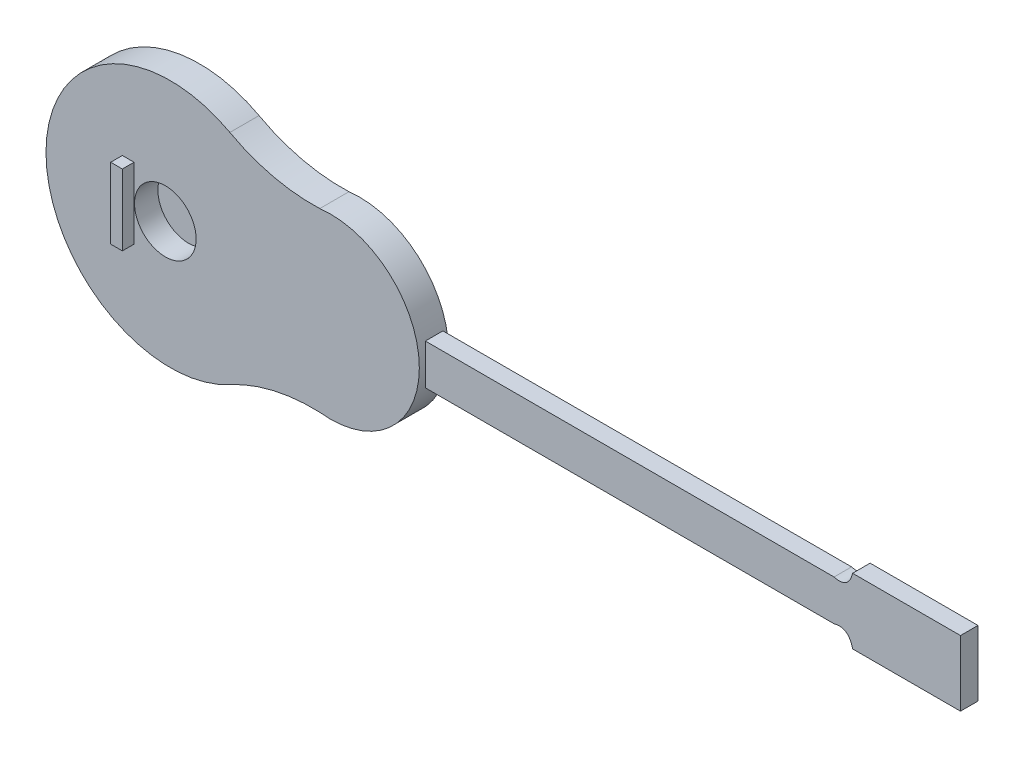
ISO-10303-21;
HEADER;
FILE_DESCRIPTION(('STEP AP214'),'2;1');
FILE_NAME('part.step','',(''),(''),'','','');
FILE_SCHEMA(('AUTOMOTIVE_DESIGN { 1 0 10303 214 1 1 1 1 }'));
ENDSEC;
DATA;
#1=APPLICATION_CONTEXT('core data for automotive mechanical design processes');
#2=APPLICATION_PROTOCOL_DEFINITION('international standard','automotive_design',2000,#1);
#3=PRODUCT_CONTEXT('',#1,'mechanical');
#4=PRODUCT('Part','Part','',(#3));
#5=PRODUCT_RELATED_PRODUCT_CATEGORY('part','',(#4));
#6=PRODUCT_DEFINITION_FORMATION('','',#4);
#7=PRODUCT_DEFINITION_CONTEXT('part definition',#1,'design');
#8=PRODUCT_DEFINITION('design','',#6,#7);
#9=PRODUCT_DEFINITION_SHAPE('','',#8);
#10=(LENGTH_UNIT() NAMED_UNIT(*) SI_UNIT(.MILLI.,.METRE.));
#11=(NAMED_UNIT(*) PLANE_ANGLE_UNIT() SI_UNIT($,.RADIAN.));
#12=(NAMED_UNIT(*) SI_UNIT($,.STERADIAN.) SOLID_ANGLE_UNIT());
#13=UNCERTAINTY_MEASURE_WITH_UNIT(LENGTH_MEASURE(1.E-05),#10,'distance_accuracy_value','');
#14=(GEOMETRIC_REPRESENTATION_CONTEXT(3) GLOBAL_UNCERTAINTY_ASSIGNED_CONTEXT((#13)) GLOBAL_UNIT_ASSIGNED_CONTEXT((#10,
#11,#12)) REPRESENTATION_CONTEXT('',''));
#15=CARTESIAN_POINT('',(0.,0.,0.));
#16=DIRECTION('',(0.,0.,1.));
#17=DIRECTION('',(1.,0.,0.));
#18=AXIS2_PLACEMENT_3D('',#15,#16,#17);
#19=CARTESIAN_POINT('',(53.8138451936766,1.73524214629143,0.482398501735472));
#20=DIRECTION('',(0.,0.,1.));
#21=DIRECTION('',(0.,-1.,0.));
#22=AXIS2_PLACEMENT_3D('',#19,#20,#21);
#23=PLANE('',#22);
#24=DIRECTION('',(0.,1.,0.));
#25=VECTOR('',#24,1.);
#26=CARTESIAN_POINT('',(18.8138451936766,1.73524214629143,0.482398501735472));
#27=LINE('',#26,#25);
#28=CARTESIAN_POINT('',(18.8138451936766,-1.73524214629143,0.482398501735472));
#29=VERTEX_POINT('',#28);
#30=CARTESIAN_POINT('',(18.8138451936766,1.73524214629143,0.482398501735472));
#31=VERTEX_POINT('',#30);
#32=EDGE_CURVE('E180',#29,#31,#27,.T.);
#33=ORIENTED_EDGE('',*,*,#32,.T.);
#34=DIRECTION('',(-1.,0.,0.));
#35=VECTOR('',#34,1.);
#36=CARTESIAN_POINT('',(53.8138451936766,1.73524214629143,0.482398501735472));
#37=LINE('',#36,#35);
#38=CARTESIAN_POINT('',(53.8138451936766,1.73524214629143,0.482398501735472));
#39=VERTEX_POINT('',#38);
#40=EDGE_CURVE('E12',#39,#31,#37,.T.);
#41=ORIENTED_EDGE('',*,*,#40,.F.);
#42=CARTESIAN_POINT('',(55.40314923386,2.80605539687066,0.482398501735472));
#43=CARTESIAN_POINT('',(55.0642516825192,1.39310710964162,0.482398501735472));
#44=CARTESIAN_POINT('',(53.8138451936766,1.73524214629143,0.482398501735472));
#45=B_SPLINE_CURVE_WITH_KNOTS('',2,(#42,#43,#44),.UNSPECIFIED.,.F.,.F.,(3,3),(0.,1.),.UNSPECIFIED.);
#46=CARTESIAN_POINT('',(55.40314923386,2.80605539687066,0.482398501735472));
#47=VERTEX_POINT('',#46);
#48=EDGE_CURVE('E138',#47,#39,#45,.T.);
#49=ORIENTED_EDGE('',*,*,#48,.F.);
#50=DIRECTION('',(-1.,0.,0.));
#51=VECTOR('',#50,1.);
#52=CARTESIAN_POINT('',(55.40314923386,2.80605539687066,0.482398501735472));
#53=LINE('',#52,#51);
#54=CARTESIAN_POINT('',(64.6425999308731,2.80605539687066,0.482398501735472));
#55=VERTEX_POINT('',#54);
#56=EDGE_CURVE('E196',#55,#47,#53,.T.);
#57=ORIENTED_EDGE('',*,*,#56,.F.);
#58=DIRECTION('',(0.,1.,0.));
#59=VECTOR('',#58,1.);
#60=CARTESIAN_POINT('',(64.6425999308731,2.80605539687066,0.482398501735472));
#61=LINE('',#60,#59);
#62=CARTESIAN_POINT('',(64.6425999308731,-2.80605539687066,0.482398501735472));
#63=VERTEX_POINT('',#62);
#64=EDGE_CURVE('E140',#63,#55,#61,.T.);
#65=ORIENTED_EDGE('',*,*,#64,.F.);
#66=DIRECTION('',(1.,0.,0.));
#67=VECTOR('',#66,1.);
#68=CARTESIAN_POINT('',(55.40314923386,-2.80605539687066,0.482398501735472));
#69=LINE('',#68,#67);
#70=CARTESIAN_POINT('',(55.40314923386,-2.80605539687066,0.482398501735472));
#71=VERTEX_POINT('',#70);
#72=EDGE_CURVE('E137',#71,#63,#69,.T.);
#73=ORIENTED_EDGE('',*,*,#72,.F.);
#74=CARTESIAN_POINT('',(53.8138451936766,-1.73524214629143,0.482398501735472));
#75=CARTESIAN_POINT('',(55.0642516825192,-1.39310710964162,0.482398501735472));
#76=CARTESIAN_POINT('',(55.40314923386,-2.80605539687066,0.482398501735472));
#77=B_SPLINE_CURVE_WITH_KNOTS('',2,(#74,#75,#76),.UNSPECIFIED.,.F.,.F.,(3,3),(0.,1.),.UNSPECIFIED.);
#78=CARTESIAN_POINT('',(53.8138451936766,-1.73524214629143,0.482398501735472));
#79=VERTEX_POINT('',#78);
#80=EDGE_CURVE('E131',#79,#71,#77,.T.);
#81=ORIENTED_EDGE('',*,*,#80,.F.);
#82=DIRECTION('',(-1.,0.,0.));
#83=VECTOR('',#82,1.);
#84=CARTESIAN_POINT('',(53.8138451936766,-1.73524214629143,0.482398501735472));
#85=LINE('',#84,#83);
#86=EDGE_CURVE('E118',#79,#29,#85,.T.);
#87=ORIENTED_EDGE('',*,*,#86,.T.);
#88=EDGE_LOOP('',(#33,#41,#49,#57,#65,#73,#81,#87));
#89=FACE_BOUND('',#88,.T.);
#90=ADVANCED_FACE('F49',(#89),#23,.F.);
#91=CARTESIAN_POINT('',(53.8138451936766,1.73524214629143,1.98239850173547));
#92=DIRECTION('',(0.,-1.,0.));
#93=DIRECTION('',(0.,0.,-1.));
#94=AXIS2_PLACEMENT_3D('',#91,#92,#93);
#95=PLANE('',#94);
#96=DIRECTION('',(0.,0.,1.));
#97=VECTOR('',#96,1.);
#98=CARTESIAN_POINT('',(18.8138451936766,1.73524214629143,1.98239850173547));
#99=LINE('',#98,#97);
#100=CARTESIAN_POINT('',(18.8138451936766,1.73524214629143,1.98239850173547));
#101=VERTEX_POINT('',#100);
#102=EDGE_CURVE('E179',#31,#101,#99,.T.);
#103=ORIENTED_EDGE('',*,*,#102,.T.);
#104=DIRECTION('',(-1.,0.,0.));
#105=VECTOR('',#104,1.);
#106=CARTESIAN_POINT('',(53.8138451936766,1.73524214629143,1.98239850173547));
#107=LINE('',#106,#105);
#108=CARTESIAN_POINT('',(53.8138451936766,1.73524214629143,1.98239850173547));
#109=VERTEX_POINT('',#108);
#110=EDGE_CURVE('E57',#109,#101,#107,.T.);
#111=ORIENTED_EDGE('',*,*,#110,.F.);
#112=DIRECTION('',(0.,0.,1.));
#113=VECTOR('',#112,1.);
#114=CARTESIAN_POINT('',(53.8138451936766,1.73524214629143,1.98239850173547));
#115=LINE('',#114,#113);
#116=EDGE_CURVE('E91',#39,#109,#115,.T.);
#117=ORIENTED_EDGE('',*,*,#116,.F.);
#118=ORIENTED_EDGE('',*,*,#40,.T.);
#119=EDGE_LOOP('',(#103,#111,#117,#118));
#120=FACE_BOUND('',#119,.T.);
#121=ADVANCED_FACE('F174',(#120),#95,.F.);
#122=CARTESIAN_POINT('',(53.8138451936766,1.73524214629143,1.98239850173547));
#123=DIRECTION('',(0.,0.,-1.));
#124=DIRECTION('',(-1.,0.,0.));
#125=AXIS2_PLACEMENT_3D('',#122,#123,#124);
#126=PLANE('',#125);
#127=DIRECTION('',(0.,-1.,0.));
#128=VECTOR('',#127,1.);
#129=CARTESIAN_POINT('',(18.8138451936766,1.73524214629143,1.98239850173547));
#130=LINE('',#129,#128);
#131=CARTESIAN_POINT('',(18.8138451936766,-1.73524214629143,1.98239850173547));
#132=VERTEX_POINT('',#131);
#133=EDGE_CURVE('E81',#101,#132,#130,.T.);
#134=ORIENTED_EDGE('',*,*,#133,.T.);
#135=DIRECTION('',(-1.,0.,0.));
#136=VECTOR('',#135,1.);
#137=CARTESIAN_POINT('',(53.8138451936766,-1.73524214629143,1.98239850173547));
#138=LINE('',#137,#136);
#139=CARTESIAN_POINT('',(53.8138451936766,-1.73524214629143,1.98239850173547));
#140=VERTEX_POINT('',#139);
#141=EDGE_CURVE('E65',#140,#132,#138,.T.);
#142=ORIENTED_EDGE('',*,*,#141,.F.);
#143=CARTESIAN_POINT('',(53.8138451936766,-1.73524214629143,1.98239850173547));
#144=CARTESIAN_POINT('',(55.0642516825192,-1.39310710964162,1.98239850173547));
#145=CARTESIAN_POINT('',(55.40314923386,-2.80605539687066,1.98239850173547));
#146=B_SPLINE_CURVE_WITH_KNOTS('',2,(#143,#144,#145),.UNSPECIFIED.,.F.,.F.,(3,3),(0.,1.),.UNSPECIFIED.);
#147=CARTESIAN_POINT('',(55.40314923386,-2.80605539687066,1.98239850173547));
#148=VERTEX_POINT('',#147);
#149=EDGE_CURVE('E132',#140,#148,#146,.T.);
#150=ORIENTED_EDGE('',*,*,#149,.T.);
#151=DIRECTION('',(1.,0.,0.));
#152=VECTOR('',#151,1.);
#153=CARTESIAN_POINT('',(55.40314923386,-2.80605539687066,1.98239850173547));
#154=LINE('',#153,#152);
#155=CARTESIAN_POINT('',(64.6425999308731,-2.80605539687066,1.98239850173547));
#156=VERTEX_POINT('',#155);
#157=EDGE_CURVE('E205',#148,#156,#154,.T.);
#158=ORIENTED_EDGE('',*,*,#157,.T.);
#159=DIRECTION('',(0.,1.,0.));
#160=VECTOR('',#159,1.);
#161=CARTESIAN_POINT('',(64.6425999308731,2.80605539687066,1.98239850173547));
#162=LINE('',#161,#160);
#163=CARTESIAN_POINT('',(64.6425999308731,2.80605539687066,1.98239850173547));
#164=VERTEX_POINT('',#163);
#165=EDGE_CURVE('E202',#156,#164,#162,.T.);
#166=ORIENTED_EDGE('',*,*,#165,.T.);
#167=DIRECTION('',(-1.,0.,0.));
#168=VECTOR('',#167,1.);
#169=CARTESIAN_POINT('',(55.40314923386,2.80605539687066,1.98239850173547));
#170=LINE('',#169,#168);
#171=CARTESIAN_POINT('',(55.40314923386,2.80605539687066,1.98239850173547));
#172=VERTEX_POINT('',#171);
#173=EDGE_CURVE('E143',#164,#172,#170,.T.);
#174=ORIENTED_EDGE('',*,*,#173,.T.);
#175=CARTESIAN_POINT('',(55.40314923386,2.80605539687066,1.98239850173547));
#176=CARTESIAN_POINT('',(55.0642516825192,1.39310710964162,1.98239850173547));
#177=CARTESIAN_POINT('',(53.8138451936766,1.73524214629143,1.98239850173547));
#178=B_SPLINE_CURVE_WITH_KNOTS('',2,(#175,#176,#177),.UNSPECIFIED.,.F.,.F.,(3,3),(0.,1.),.UNSPECIFIED.);
#179=EDGE_CURVE('E185',#172,#109,#178,.T.);
#180=ORIENTED_EDGE('',*,*,#179,.T.);
#181=ORIENTED_EDGE('',*,*,#110,.T.);
#182=EDGE_LOOP('',(#134,#142,#150,#158,#166,#174,#180,#181));
#183=FACE_BOUND('',#182,.T.);
#184=ADVANCED_FACE('F172',(#183),#126,.F.);
#185=CARTESIAN_POINT('',(53.8138451936766,-1.73524214629143,1.98239850173547));
#186=DIRECTION('',(0.,1.,0.));
#187=DIRECTION('',(0.,0.,1.));
#188=AXIS2_PLACEMENT_3D('',#185,#186,#187);
#189=PLANE('',#188);
#190=DIRECTION('',(0.,0.,-1.));
#191=VECTOR('',#190,1.);
#192=CARTESIAN_POINT('',(18.8138451936766,-1.73524214629143,1.98239850173547));
#193=LINE('',#192,#191);
#194=EDGE_CURVE('E86',#132,#29,#193,.T.);
#195=ORIENTED_EDGE('',*,*,#194,.T.);
#196=ORIENTED_EDGE('',*,*,#86,.F.);
#197=DIRECTION('',(0.,0.,-1.));
#198=VECTOR('',#197,1.);
#199=CARTESIAN_POINT('',(53.8138451936766,-1.73524214629143,1.98239850173547));
#200=LINE('',#199,#198);
#201=EDGE_CURVE('E121',#140,#79,#200,.T.);
#202=ORIENTED_EDGE('',*,*,#201,.F.);
#203=ORIENTED_EDGE('',*,*,#141,.T.);
#204=EDGE_LOOP('',(#195,#196,#202,#203));
#205=FACE_BOUND('',#204,.T.);
#206=ADVANCED_FACE('F120',(#205),#189,.F.);
#207=CARTESIAN_POINT('',(18.8138451936766,0.,0.));
#208=DIRECTION('',(1.,0.,0.));
#209=DIRECTION('',(0.,0.,-1.));
#210=AXIS2_PLACEMENT_3D('',#207,#208,#209);
#211=PLANE('',#210);
#212=ORIENTED_EDGE('',*,*,#32,.F.);
#213=ORIENTED_EDGE('',*,*,#194,.F.);
#214=ORIENTED_EDGE('',*,*,#133,.F.);
#215=ORIENTED_EDGE('',*,*,#102,.F.);
#216=EDGE_LOOP('',(#212,#213,#214,#215));
#217=FACE_BOUND('',#216,.T.);
#218=ADVANCED_FACE('F165',(#217),#211,.F.);
#219=DIRECTION('',(0.,0.,1.));
#220=VECTOR('',#219,1.);
#221=SURFACE_OF_LINEAR_EXTRUSION('',#45,#220);
#222=ORIENTED_EDGE('',*,*,#179,.F.);
#223=DIRECTION('',(0.,0.,1.));
#224=VECTOR('',#223,1.);
#225=CARTESIAN_POINT('',(55.40314923386,2.80605539687066,0.482398501735472));
#226=LINE('',#225,#224);
#227=EDGE_CURVE('E190',#47,#172,#226,.T.);
#228=ORIENTED_EDGE('',*,*,#227,.F.);
#229=ORIENTED_EDGE('',*,*,#48,.T.);
#230=ORIENTED_EDGE('',*,*,#116,.T.);
#231=EDGE_LOOP('',(#222,#228,#229,#230));
#232=FACE_BOUND('',#231,.T.);
#233=ADVANCED_FACE('F161',(#232),#221,.T.);
#234=CARTESIAN_POINT('',(55.40314923386,2.80605539687066,0.482398501735472));
#235=DIRECTION('',(0.,1.,0.));
#236=DIRECTION('',(0.,0.,1.));
#237=AXIS2_PLACEMENT_3D('',#234,#235,#236);
#238=PLANE('',#237);
#239=ORIENTED_EDGE('',*,*,#173,.F.);
#240=DIRECTION('',(0.,0.,1.));
#241=VECTOR('',#240,1.);
#242=CARTESIAN_POINT('',(64.6425999308731,2.80605539687066,0.482398501735472));
#243=LINE('',#242,#241);
#244=EDGE_CURVE('E198',#55,#164,#243,.T.);
#245=ORIENTED_EDGE('',*,*,#244,.F.);
#246=ORIENTED_EDGE('',*,*,#56,.T.);
#247=ORIENTED_EDGE('',*,*,#227,.T.);
#248=EDGE_LOOP('',(#239,#245,#246,#247));
#249=FACE_BOUND('',#248,.T.);
#250=ADVANCED_FACE('F164',(#249),#238,.T.);
#251=CARTESIAN_POINT('',(64.6425999308731,2.80605539687066,0.482398501735472));
#252=DIRECTION('',(1.,0.,0.));
#253=DIRECTION('',(0.,0.,-1.));
#254=AXIS2_PLACEMENT_3D('',#251,#252,#253);
#255=PLANE('',#254);
#256=ORIENTED_EDGE('',*,*,#165,.F.);
#257=DIRECTION('',(0.,0.,1.));
#258=VECTOR('',#257,1.);
#259=CARTESIAN_POINT('',(64.6425999308731,-2.80605539687066,0.482398501735472));
#260=LINE('',#259,#258);
#261=EDGE_CURVE('E195',#63,#156,#260,.T.);
#262=ORIENTED_EDGE('',*,*,#261,.F.);
#263=ORIENTED_EDGE('',*,*,#64,.T.);
#264=ORIENTED_EDGE('',*,*,#244,.T.);
#265=EDGE_LOOP('',(#256,#262,#263,#264));
#266=FACE_BOUND('',#265,.T.);
#267=ADVANCED_FACE('F225',(#266),#255,.T.);
#268=CARTESIAN_POINT('',(55.40314923386,-2.80605539687066,0.482398501735472));
#269=DIRECTION('',(0.,-1.,0.));
#270=DIRECTION('',(0.,0.,-1.));
#271=AXIS2_PLACEMENT_3D('',#268,#269,#270);
#272=PLANE('',#271);
#273=ORIENTED_EDGE('',*,*,#157,.F.);
#274=DIRECTION('',(0.,0.,1.));
#275=VECTOR('',#274,1.);
#276=CARTESIAN_POINT('',(55.40314923386,-2.80605539687066,0.482398501735472));
#277=LINE('',#276,#275);
#278=EDGE_CURVE('E193',#71,#148,#277,.T.);
#279=ORIENTED_EDGE('',*,*,#278,.F.);
#280=ORIENTED_EDGE('',*,*,#72,.T.);
#281=ORIENTED_EDGE('',*,*,#261,.T.);
#282=EDGE_LOOP('',(#273,#279,#280,#281));
#283=FACE_BOUND('',#282,.T.);
#284=ADVANCED_FACE('F159',(#283),#272,.T.);
#285=DIRECTION('',(0.,0.,1.));
#286=VECTOR('',#285,1.);
#287=SURFACE_OF_LINEAR_EXTRUSION('',#77,#286);
#288=ORIENTED_EDGE('',*,*,#149,.F.);
#289=ORIENTED_EDGE('',*,*,#201,.T.);
#290=ORIENTED_EDGE('',*,*,#80,.T.);
#291=ORIENTED_EDGE('',*,*,#278,.T.);
#292=EDGE_LOOP('',(#288,#289,#290,#291));
#293=FACE_BOUND('',#292,.T.);
#294=ADVANCED_FACE('F130',(#293),#287,.T.);
#295=CLOSED_SHELL('',(#90,#121,#184,#206,#218,#233,#250,#267,#284,#294));
#296=MANIFOLD_SOLID_BREP('B2',#295);
#297=CARTESIAN_POINT('',(10.4433751897941,-11.1883730425506,2.5));
#298=DIRECTION('',(0.,0.,-1.));
#299=DIRECTION('',(-1.,0.,0.));
#300=AXIS2_PLACEMENT_3D('',#297,#298,#299);
#301=PLANE('',#300);
#302=CARTESIAN_POINT('',(9.68424817200886,-22.3767460851013,2.5));
#303=DIRECTION('',(0.,0.,-1.));
#304=DIRECTION('',(-1.,0.,0.));
#305=AXIS2_PLACEMENT_3D('',#302,#303,#304);
#306=CIRCLE('',#305,14.8327460457866);
#307=CARTESIAN_POINT('',(2.58721392063818,-9.35205952097742,2.5));
#308=VERTEX_POINT('',#307);
#309=CARTESIAN_POINT('',(10.2890987750528,-7.55633748726583,2.5));
#310=VERTEX_POINT('',#309);
#311=EDGE_CURVE('E403',#308,#310,#306,.T.);
#312=ORIENTED_EDGE('',*,*,#311,.T.);
#313=CARTESIAN_POINT('',(11.2025022075794,0.,2.5));
#314=DIRECTION('',(0.,0.,1.));
#315=DIRECTION('',(1.,0.,0.));
#316=AXIS2_PLACEMENT_3D('',#313,#314,#315);
#317=CIRCLE('',#316,7.61134298609716);
#318=CARTESIAN_POINT('',(10.2890987750528,7.55633748726583,2.5));
#319=VERTEX_POINT('',#318);
#320=EDGE_CURVE('E406',#310,#319,#317,.T.);
#321=ORIENTED_EDGE('',*,*,#320,.T.);
#322=CARTESIAN_POINT('',(9.68424817200886,22.3767460851013,2.5));
#323=DIRECTION('',(0.,0.,-1.));
#324=DIRECTION('',(1.,0.,0.));
#325=AXIS2_PLACEMENT_3D('',#322,#323,#324);
#326=CIRCLE('',#325,14.8327460457866);
#327=CARTESIAN_POINT('',(2.58721392063818,9.35205952097741,2.5));
#328=VERTEX_POINT('',#327);
#329=EDGE_CURVE('E409',#319,#328,#326,.T.);
#330=ORIENTED_EDGE('',*,*,#329,.T.);
#331=CARTESIAN_POINT('',(-2.5086389748974,0.,2.5));
#332=DIRECTION('',(0.,0.,1.));
#333=DIRECTION('',(1.,0.,0.));
#334=AXIS2_PLACEMENT_3D('',#331,#332,#333);
#335=CIRCLE('',#334,10.6502926728256);
#336=EDGE_CURVE('E411',#328,#308,#335,.T.);
#337=ORIENTED_EDGE('',*,*,#336,.T.);
#338=EDGE_LOOP('',(#312,#321,#330,#337));
#339=FACE_BOUND('',#338,.T.);
#340=CARTESIAN_POINT('',(-2.93939971593702,0.,2.5));
#341=DIRECTION('',(0.,0.,1.));
#342=DIRECTION('',(1.,0.,0.));
#343=AXIS2_PLACEMENT_3D('',#340,#341,#342);
#344=CIRCLE('',#343,2.63927529279551);
#345=CARTESIAN_POINT('',(-0.30012442314151,0.,2.5));
#346=VERTEX_POINT('',#345);
#347=EDGE_CURVE('E391',#346,#346,#344,.T.);
#348=ORIENTED_EDGE('',*,*,#347,.F.);
#349=EDGE_LOOP('',(#348));
#350=FACE_BOUND('',#349,.T.);
#351=DIRECTION('',(0.,1.,0.));
#352=VECTOR('',#351,1.);
#353=CARTESIAN_POINT('',(-5.61861916121142,3.03862693183559,2.5));
#354=LINE('',#353,#352);
#355=CARTESIAN_POINT('',(-5.61861916121142,-3.03862693183559,2.5));
#356=VERTEX_POINT('',#355);
#357=CARTESIAN_POINT('',(-5.61861916121142,3.03862693183559,2.5));
#358=VERTEX_POINT('',#357);
#359=EDGE_CURVE('E390',#356,#358,#354,.T.);
#360=ORIENTED_EDGE('',*,*,#359,.F.);
#361=DIRECTION('',(1.,0.,0.));
#362=VECTOR('',#361,1.);
#363=CARTESIAN_POINT('',(-6.61861916121142,-3.03862693183559,2.5));
#364=LINE('',#363,#362);
#365=CARTESIAN_POINT('',(-6.61861916121142,-3.03862693183559,2.5));
#366=VERTEX_POINT('',#365);
#367=EDGE_CURVE('E387',#366,#356,#364,.T.);
#368=ORIENTED_EDGE('',*,*,#367,.F.);
#369=DIRECTION('',(0.,-1.,0.));
#370=VECTOR('',#369,1.);
#371=CARTESIAN_POINT('',(-6.61861916121143,3.03862693183559,2.5));
#372=LINE('',#371,#370);
#373=CARTESIAN_POINT('',(-6.61861916121142,3.03862693183559,2.5));
#374=VERTEX_POINT('',#373);
#375=EDGE_CURVE('E325',#374,#366,#372,.T.);
#376=ORIENTED_EDGE('',*,*,#375,.F.);
#377=DIRECTION('',(-1.,0.,0.));
#378=VECTOR('',#377,1.);
#379=CARTESIAN_POINT('',(-6.61861916121143,3.03862693183559,2.5));
#380=LINE('',#379,#378);
#381=EDGE_CURVE('E320',#358,#374,#380,.T.);
#382=ORIENTED_EDGE('',*,*,#381,.F.);
#383=EDGE_LOOP('',(#360,#368,#376,#382));
#384=FACE_BOUND('',#383,.T.);
#385=ADVANCED_FACE('F305',(#339,#350,#384),#301,.F.);
#386=CARTESIAN_POINT('',(9.68424817200886,-22.3767460851013,2.5));
#387=DIRECTION('',(0.,0.,-1.));
#388=DIRECTION('',(-1.,0.,0.));
#389=AXIS2_PLACEMENT_3D('',#386,#387,#388);
#390=CYLINDRICAL_SURFACE('',#389,14.8327460457866);
#391=CARTESIAN_POINT('',(9.68424817200886,-22.3767460851013,0.));
#392=DIRECTION('',(0.,0.,-1.));
#393=DIRECTION('',(-1.,0.,0.));
#394=AXIS2_PLACEMENT_3D('',#391,#392,#393);
#395=CIRCLE('',#394,14.8327460457866);
#396=CARTESIAN_POINT('',(2.58721392063818,-9.35205952097742,0.));
#397=VERTEX_POINT('',#396);
#398=CARTESIAN_POINT('',(10.2890987750528,-7.55633748726583,0.));
#399=VERTEX_POINT('',#398);
#400=EDGE_CURVE('E401',#397,#399,#395,.T.);
#401=ORIENTED_EDGE('',*,*,#400,.T.);
#402=DIRECTION('',(0.,0.,-1.));
#403=VECTOR('',#402,1.);
#404=CARTESIAN_POINT('',(10.2890987750528,-7.55633748726583,2.5));
#405=LINE('',#404,#403);
#406=EDGE_CURVE('E47',#310,#399,#405,.T.);
#407=ORIENTED_EDGE('',*,*,#406,.F.);
#408=ORIENTED_EDGE('',*,*,#311,.F.);
#409=DIRECTION('',(0.,0.,-1.));
#410=VECTOR('',#409,1.);
#411=CARTESIAN_POINT('',(2.58721392063818,-9.35205952097742,2.5));
#412=LINE('',#411,#410);
#413=EDGE_CURVE('E413',#308,#397,#412,.T.);
#414=ORIENTED_EDGE('',*,*,#413,.T.);
#415=EDGE_LOOP('',(#401,#407,#408,#414));
#416=FACE_BOUND('',#415,.T.);
#417=ADVANCED_FACE('F307',(#416),#390,.F.);
#418=CARTESIAN_POINT('',(11.2025022075794,0.,2.5));
#419=DIRECTION('',(0.,0.,-1.));
#420=DIRECTION('',(-1.,0.,0.));
#421=AXIS2_PLACEMENT_3D('',#418,#419,#420);
#422=CYLINDRICAL_SURFACE('',#421,7.61134298609716);
#423=CARTESIAN_POINT('',(11.2025022075794,0.,0.));
#424=DIRECTION('',(0.,0.,1.));
#425=DIRECTION('',(1.,0.,0.));
#426=AXIS2_PLACEMENT_3D('',#423,#424,#425);
#427=CIRCLE('',#426,7.61134298609716);
#428=CARTESIAN_POINT('',(10.2890987750528,7.55633748726583,0.));
#429=VERTEX_POINT('',#428);
#430=EDGE_CURVE('E416',#399,#429,#427,.T.);
#431=ORIENTED_EDGE('',*,*,#430,.T.);
#432=DIRECTION('',(0.,0.,-1.));
#433=VECTOR('',#432,1.);
#434=CARTESIAN_POINT('',(10.2890987750528,7.55633748726583,2.5));
#435=LINE('',#434,#433);
#436=EDGE_CURVE('E313',#319,#429,#435,.T.);
#437=ORIENTED_EDGE('',*,*,#436,.F.);
#438=ORIENTED_EDGE('',*,*,#320,.F.);
#439=ORIENTED_EDGE('',*,*,#406,.T.);
#440=EDGE_LOOP('',(#431,#437,#438,#439));
#441=FACE_BOUND('',#440,.T.);
#442=ADVANCED_FACE('F446',(#441),#422,.T.);
#443=CARTESIAN_POINT('',(9.68424817200886,22.3767460851013,2.5));
#444=DIRECTION('',(0.,0.,-1.));
#445=DIRECTION('',(-1.,0.,0.));
#446=AXIS2_PLACEMENT_3D('',#443,#444,#445);
#447=CYLINDRICAL_SURFACE('',#446,14.8327460457866);
#448=CARTESIAN_POINT('',(9.68424817200886,22.3767460851013,0.));
#449=DIRECTION('',(0.,0.,-1.));
#450=DIRECTION('',(1.,0.,0.));
#451=AXIS2_PLACEMENT_3D('',#448,#449,#450);
#452=CIRCLE('',#451,14.8327460457866);
#453=CARTESIAN_POINT('',(2.58721392063818,9.35205952097741,0.));
#454=VERTEX_POINT('',#453);
#455=EDGE_CURVE('E418',#429,#454,#452,.T.);
#456=ORIENTED_EDGE('',*,*,#455,.T.);
#457=DIRECTION('',(0.,0.,-1.));
#458=VECTOR('',#457,1.);
#459=CARTESIAN_POINT('',(2.58721392063818,9.35205952097741,2.5));
#460=LINE('',#459,#458);
#461=EDGE_CURVE('E423',#328,#454,#460,.T.);
#462=ORIENTED_EDGE('',*,*,#461,.F.);
#463=ORIENTED_EDGE('',*,*,#329,.F.);
#464=ORIENTED_EDGE('',*,*,#436,.T.);
#465=EDGE_LOOP('',(#456,#462,#463,#464));
#466=FACE_BOUND('',#465,.T.);
#467=ADVANCED_FACE('F430',(#466),#447,.F.);
#468=CARTESIAN_POINT('',(-2.5086389748974,0.,2.5));
#469=DIRECTION('',(0.,0.,-1.));
#470=DIRECTION('',(-1.,0.,0.));
#471=AXIS2_PLACEMENT_3D('',#468,#469,#470);
#472=CYLINDRICAL_SURFACE('',#471,10.6502926728256);
#473=CARTESIAN_POINT('',(-2.5086389748974,0.,0.));
#474=DIRECTION('',(0.,0.,1.));
#475=DIRECTION('',(1.,0.,0.));
#476=AXIS2_PLACEMENT_3D('',#473,#474,#475);
#477=CIRCLE('',#476,10.6502926728256);
#478=EDGE_CURVE('E407',#454,#397,#477,.T.);
#479=ORIENTED_EDGE('',*,*,#478,.T.);
#480=ORIENTED_EDGE('',*,*,#413,.F.);
#481=ORIENTED_EDGE('',*,*,#336,.F.);
#482=ORIENTED_EDGE('',*,*,#461,.T.);
#483=EDGE_LOOP('',(#479,#480,#481,#482));
#484=FACE_BOUND('',#483,.T.);
#485=ADVANCED_FACE('F439',(#484),#472,.T.);
#486=CARTESIAN_POINT('',(10.4433751897941,-11.1883730425506,0.));
#487=DIRECTION('',(0.,0.,-1.));
#488=DIRECTION('',(-1.,0.,0.));
#489=AXIS2_PLACEMENT_3D('',#486,#487,#488);
#490=PLANE('',#489);
#491=ORIENTED_EDGE('',*,*,#400,.F.);
#492=ORIENTED_EDGE('',*,*,#478,.F.);
#493=ORIENTED_EDGE('',*,*,#455,.F.);
#494=ORIENTED_EDGE('',*,*,#430,.F.);
#495=EDGE_LOOP('',(#491,#492,#493,#494));
#496=FACE_BOUND('',#495,.T.);
#497=ADVANCED_FACE('F436',(#496),#490,.T.);
#498=CARTESIAN_POINT('',(-2.93939971593702,0.,0.5));
#499=DIRECTION('',(0.,0.,1.));
#500=DIRECTION('',(1.,0.,0.));
#501=AXIS2_PLACEMENT_3D('',#498,#499,#500);
#502=CYLINDRICAL_SURFACE('',#501,2.63927529279551);
#503=CARTESIAN_POINT('',(-2.93939971593702,0.,0.5));
#504=DIRECTION('',(0.,0.,1.));
#505=DIRECTION('',(1.,0.,0.));
#506=AXIS2_PLACEMENT_3D('',#503,#504,#505);
#507=CIRCLE('',#506,2.63927529279551);
#508=CARTESIAN_POINT('',(-0.30012442314151,0.,0.5));
#509=VERTEX_POINT('',#508);
#510=EDGE_CURVE('E394',#509,#509,#507,.T.);
#511=ORIENTED_EDGE('',*,*,#510,.F.);
#512=EDGE_LOOP('',(#511));
#513=FACE_BOUND('',#512,.T.);
#514=ORIENTED_EDGE('',*,*,#347,.T.);
#515=EDGE_LOOP('',(#514));
#516=FACE_BOUND('',#515,.T.);
#517=ADVANCED_FACE('F459',(#513,#516),#502,.F.);
#518=CARTESIAN_POINT('',(-2.93939971593702,0.,0.5));
#519=DIRECTION('',(0.,0.,1.));
#520=DIRECTION('',(1.,0.,0.));
#521=AXIS2_PLACEMENT_3D('',#518,#519,#520);
#522=PLANE('',#521);
#523=ORIENTED_EDGE('',*,*,#510,.T.);
#524=EDGE_LOOP('',(#523));
#525=FACE_BOUND('',#524,.T.);
#526=ADVANCED_FACE('F479',(#525),#522,.T.);
#527=CARTESIAN_POINT('',(-5.61861916121142,3.03862693183559,3.5));
#528=DIRECTION('',(-1.,0.,0.));
#529=DIRECTION('',(0.,0.,1.));
#530=AXIS2_PLACEMENT_3D('',#527,#528,#529);
#531=PLANE('',#530);
#532=ORIENTED_EDGE('',*,*,#359,.T.);
#533=DIRECTION('',(0.,0.,-1.));
#534=VECTOR('',#533,1.);
#535=CARTESIAN_POINT('',(-5.61861916121142,3.03862693183559,3.5));
#536=LINE('',#535,#534);
#537=CARTESIAN_POINT('',(-5.61861916121142,3.03862693183559,3.5));
#538=VERTEX_POINT('',#537);
#539=EDGE_CURVE('E371',#538,#358,#536,.T.);
#540=ORIENTED_EDGE('',*,*,#539,.F.);
#541=DIRECTION('',(0.,1.,0.));
#542=VECTOR('',#541,1.);
#543=CARTESIAN_POINT('',(-5.61861916121142,3.03862693183559,3.5));
#544=LINE('',#543,#542);
#545=CARTESIAN_POINT('',(-5.61861916121142,-3.03862693183559,3.5));
#546=VERTEX_POINT('',#545);
#547=EDGE_CURVE('E378',#546,#538,#544,.T.);
#548=ORIENTED_EDGE('',*,*,#547,.F.);
#549=DIRECTION('',(0.,0.,-1.));
#550=VECTOR('',#549,1.);
#551=CARTESIAN_POINT('',(-5.61861916121142,-3.03862693183559,3.5));
#552=LINE('',#551,#550);
#553=EDGE_CURVE('E559',#546,#356,#552,.T.);
#554=ORIENTED_EDGE('',*,*,#553,.T.);
#555=EDGE_LOOP('',(#532,#540,#548,#554));
#556=FACE_BOUND('',#555,.T.);
#557=ADVANCED_FACE('F389',(#556),#531,.F.);
#558=CARTESIAN_POINT('',(-6.61861916121143,3.03862693183559,3.5));
#559=DIRECTION('',(0.,-1.,0.));
#560=DIRECTION('',(0.,0.,-1.));
#561=AXIS2_PLACEMENT_3D('',#558,#559,#560);
#562=PLANE('',#561);
#563=ORIENTED_EDGE('',*,*,#381,.T.);
#564=DIRECTION('',(0.,0.,-1.));
#565=VECTOR('',#564,1.);
#566=CARTESIAN_POINT('',(-6.61861916121143,3.03862693183559,3.5));
#567=LINE('',#566,#565);
#568=CARTESIAN_POINT('',(-6.61861916121143,3.03862693183559,3.5));
#569=VERTEX_POINT('',#568);
#570=EDGE_CURVE('E374',#569,#374,#567,.T.);
#571=ORIENTED_EDGE('',*,*,#570,.F.);
#572=DIRECTION('',(-1.,0.,0.));
#573=VECTOR('',#572,1.);
#574=CARTESIAN_POINT('',(-6.61861916121143,3.03862693183559,3.5));
#575=LINE('',#574,#573);
#576=EDGE_CURVE('E367',#538,#569,#575,.T.);
#577=ORIENTED_EDGE('',*,*,#576,.F.);
#578=ORIENTED_EDGE('',*,*,#539,.T.);
#579=EDGE_LOOP('',(#563,#571,#577,#578));
#580=FACE_BOUND('',#579,.T.);
#581=ADVANCED_FACE('F369',(#580),#562,.F.);
#582=CARTESIAN_POINT('',(-6.61861916121143,3.03862693183559,3.5));
#583=DIRECTION('',(1.,0.,0.));
#584=DIRECTION('',(0.,1.,0.));
#585=AXIS2_PLACEMENT_3D('',#582,#583,#584);
#586=PLANE('',#585);
#587=ORIENTED_EDGE('',*,*,#375,.T.);
#588=DIRECTION('',(0.,0.,-1.));
#589=VECTOR('',#588,1.);
#590=CARTESIAN_POINT('',(-6.61861916121142,-3.03862693183559,3.5));
#591=LINE('',#590,#589);
#592=CARTESIAN_POINT('',(-6.61861916121142,-3.03862693183559,3.5));
#593=VERTEX_POINT('',#592);
#594=EDGE_CURVE('E396',#593,#366,#591,.T.);
#595=ORIENTED_EDGE('',*,*,#594,.F.);
#596=DIRECTION('',(0.,-1.,0.));
#597=VECTOR('',#596,1.);
#598=CARTESIAN_POINT('',(-6.61861916121143,3.03862693183559,3.5));
#599=LINE('',#598,#597);
#600=EDGE_CURVE('E377',#569,#593,#599,.T.);
#601=ORIENTED_EDGE('',*,*,#600,.F.);
#602=ORIENTED_EDGE('',*,*,#570,.T.);
#603=EDGE_LOOP('',(#587,#595,#601,#602));
#604=FACE_BOUND('',#603,.T.);
#605=ADVANCED_FACE('F498',(#604),#586,.F.);
#606=CARTESIAN_POINT('',(-6.61861916121142,-3.03862693183559,3.5));
#607=DIRECTION('',(0.,1.,0.));
#608=DIRECTION('',(0.,0.,1.));
#609=AXIS2_PLACEMENT_3D('',#606,#607,#608);
#610=PLANE('',#609);
#611=ORIENTED_EDGE('',*,*,#367,.T.);
#612=ORIENTED_EDGE('',*,*,#553,.F.);
#613=DIRECTION('',(1.,0.,0.));
#614=VECTOR('',#613,1.);
#615=CARTESIAN_POINT('',(-6.61861916121142,-3.03862693183559,3.5));
#616=LINE('',#615,#614);
#617=EDGE_CURVE('E383',#593,#546,#616,.T.);
#618=ORIENTED_EDGE('',*,*,#617,.F.);
#619=ORIENTED_EDGE('',*,*,#594,.T.);
#620=EDGE_LOOP('',(#611,#612,#618,#619));
#621=FACE_BOUND('',#620,.T.);
#622=ADVANCED_FACE('F505',(#621),#610,.F.);
#623=CARTESIAN_POINT('',(0.,0.,3.5));
#624=DIRECTION('',(0.,0.,1.));
#625=DIRECTION('',(1.,0.,0.));
#626=AXIS2_PLACEMENT_3D('',#623,#624,#625);
#627=PLANE('',#626);
#628=ORIENTED_EDGE('',*,*,#547,.T.);
#629=ORIENTED_EDGE('',*,*,#576,.T.);
#630=ORIENTED_EDGE('',*,*,#600,.T.);
#631=ORIENTED_EDGE('',*,*,#617,.T.);
#632=EDGE_LOOP('',(#628,#629,#630,#631));
#633=FACE_BOUND('',#632,.T.);
#634=ADVANCED_FACE('F381',(#633),#627,.T.);
#635=CLOSED_SHELL('',(#385,#417,#442,#467,#485,#497,#517,#526,#557,#581,#605,#622,#634));
#636=MANIFOLD_SOLID_BREP('B6',#635);
#637=ADVANCED_BREP_SHAPE_REPRESENTATION('',(#18,#296,#636),#14);
#638=SHAPE_DEFINITION_REPRESENTATION(#9,#637);
ENDSEC;
END-ISO-10303-21;
